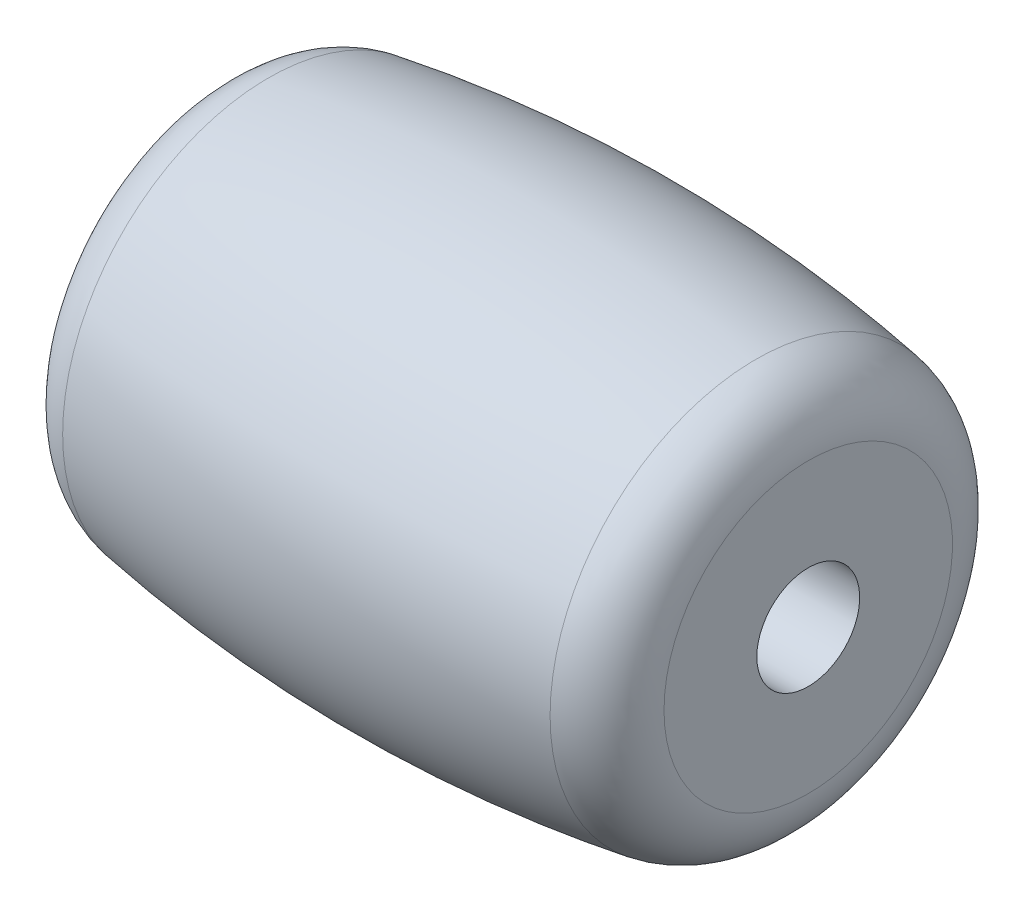
ISO-10303-21;
HEADER;
FILE_DESCRIPTION(('STEP AP214'),'2;1');
FILE_NAME('part.step','',(''),(''),'','','');
FILE_SCHEMA(('AUTOMOTIVE_DESIGN { 1 0 10303 214 1 1 1 1 }'));
ENDSEC;
DATA;
#1=APPLICATION_CONTEXT('core data for automotive mechanical design processes');
#2=APPLICATION_PROTOCOL_DEFINITION('international standard','automotive_design',2000,#1);
#3=PRODUCT_CONTEXT('',#1,'mechanical');
#4=PRODUCT('Part','Part','',(#3));
#5=PRODUCT_RELATED_PRODUCT_CATEGORY('part','',(#4));
#6=PRODUCT_DEFINITION_FORMATION('','',#4);
#7=PRODUCT_DEFINITION_CONTEXT('part definition',#1,'design');
#8=PRODUCT_DEFINITION('design','',#6,#7);
#9=PRODUCT_DEFINITION_SHAPE('','',#8);
#10=(LENGTH_UNIT() NAMED_UNIT(*) SI_UNIT(.MILLI.,.METRE.));
#11=(NAMED_UNIT(*) PLANE_ANGLE_UNIT() SI_UNIT($,.RADIAN.));
#12=(NAMED_UNIT(*) SI_UNIT($,.STERADIAN.) SOLID_ANGLE_UNIT());
#13=UNCERTAINTY_MEASURE_WITH_UNIT(LENGTH_MEASURE(1.E-05),#10,'distance_accuracy_value','');
#14=(GEOMETRIC_REPRESENTATION_CONTEXT(3) GLOBAL_UNCERTAINTY_ASSIGNED_CONTEXT((#13)) GLOBAL_UNIT_ASSIGNED_CONTEXT((#10,
#11,#12)) REPRESENTATION_CONTEXT('',''));
#15=CARTESIAN_POINT('',(0.,0.,0.));
#16=DIRECTION('',(0.,0.,1.));
#17=DIRECTION('',(1.,0.,0.));
#18=AXIS2_PLACEMENT_3D('',#15,#16,#17);
#19=CARTESIAN_POINT('',(7.5,0.,0.));
#20=DIRECTION('',(-1.,0.,0.));
#21=DIRECTION('',(0.,0.,1.));
#22=AXIS2_PLACEMENT_3D('',#19,#20,#21);
#23=TOROIDAL_SURFACE('',#22,4.627561796352,2.00000000000046);
#24=CARTESIAN_POINT('',(9.5,0.,0.));
#25=DIRECTION('',(-1.,0.,0.));
#26=DIRECTION('',(0.,0.,1.));
#27=AXIS2_PLACEMENT_3D('',#24,#25,#26);
#28=CIRCLE('',#27,4.627561796352);
#29=CARTESIAN_POINT('',(9.5,0.,4.627561796352));
#30=VERTEX_POINT('',#29);
#31=EDGE_CURVE('E10',#30,#30,#28,.T.);
#32=ORIENTED_EDGE('',*,*,#31,.T.);
#33=EDGE_LOOP('',(#32));
#34=FACE_BOUND('',#33,.T.);
#35=CARTESIAN_POINT('',(7.81924059641901,0.,0.));
#36=DIRECTION('',(-1.,0.,0.));
#37=DIRECTION('',(0.,0.,1.));
#38=AXIS2_PLACEMENT_3D('',#35,#36,#37);
#39=CIRCLE('',#38,6.60191876549436);
#40=CARTESIAN_POINT('',(7.81924059641901,0.,6.60191876549436));
#41=VERTEX_POINT('',#40);
#42=EDGE_CURVE('E53',#41,#41,#39,.T.);
#43=ORIENTED_EDGE('',*,*,#42,.F.);
#44=EDGE_LOOP('',(#43));
#45=FACE_BOUND('',#44,.T.);
#46=ADVANCED_FACE('F31',(#34,#45),#23,.T.);
#47=CARTESIAN_POINT('',(9.5,4.627561796352,0.));
#48=DIRECTION('',(1.,0.,0.));
#49=DIRECTION('',(0.,0.,-1.));
#50=AXIS2_PLACEMENT_3D('',#47,#48,#49);
#51=PLANE('',#50);
#52=CARTESIAN_POINT('',(9.5,0.,0.));
#53=DIRECTION('',(-1.,0.,0.));
#54=DIRECTION('',(0.,0.,1.));
#55=AXIS2_PLACEMENT_3D('',#52,#53,#54);
#56=CIRCLE('',#55,1.65);
#57=CARTESIAN_POINT('',(9.5,0.,1.65));
#58=VERTEX_POINT('',#57);
#59=EDGE_CURVE('E37',#58,#58,#56,.T.);
#60=ORIENTED_EDGE('',*,*,#59,.T.);
#61=EDGE_LOOP('',(#60));
#62=FACE_BOUND('',#61,.T.);
#63=ORIENTED_EDGE('',*,*,#31,.F.);
#64=EDGE_LOOP('',(#63));
#65=FACE_BOUND('',#64,.T.);
#66=ADVANCED_FACE('F61',(#62,#65),#51,.T.);
#67=CARTESIAN_POINT('',(9.50308908178157,0.,0.));
#68=DIRECTION('',(-1.,0.,0.));
#69=DIRECTION('',(0.,0.,1.));
#70=AXIS2_PLACEMENT_3D('',#67,#68,#69);
#71=CYLINDRICAL_SURFACE('',#70,1.65);
#72=CARTESIAN_POINT('',(-9.5,0.,0.));
#73=DIRECTION('',(-1.,0.,0.));
#74=DIRECTION('',(0.,0.,1.));
#75=AXIS2_PLACEMENT_3D('',#72,#73,#74);
#76=CIRCLE('',#75,1.65);
#77=CARTESIAN_POINT('',(-9.5,0.,1.65));
#78=VERTEX_POINT('',#77);
#79=EDGE_CURVE('E41',#78,#78,#76,.T.);
#80=ORIENTED_EDGE('',*,*,#79,.T.);
#81=EDGE_LOOP('',(#80));
#82=FACE_BOUND('',#81,.T.);
#83=ORIENTED_EDGE('',*,*,#59,.F.);
#84=EDGE_LOOP('',(#83));
#85=FACE_BOUND('',#84,.T.);
#86=ADVANCED_FACE('F65',(#82,#85),#71,.F.);
#87=CARTESIAN_POINT('',(-9.5,1.65,0.));
#88=DIRECTION('',(-1.,0.,0.));
#89=DIRECTION('',(0.,0.,1.));
#90=AXIS2_PLACEMENT_3D('',#87,#88,#89);
#91=PLANE('',#90);
#92=CARTESIAN_POINT('',(-9.5,0.,0.));
#93=DIRECTION('',(-1.,0.,0.));
#94=DIRECTION('',(0.,0.,1.));
#95=AXIS2_PLACEMENT_3D('',#92,#93,#94);
#96=CIRCLE('',#95,4.627561796352);
#97=CARTESIAN_POINT('',(-9.5,0.,4.627561796352));
#98=VERTEX_POINT('',#97);
#99=EDGE_CURVE('E45',#98,#98,#96,.T.);
#100=ORIENTED_EDGE('',*,*,#99,.T.);
#101=EDGE_LOOP('',(#100));
#102=FACE_BOUND('',#101,.T.);
#103=ORIENTED_EDGE('',*,*,#79,.F.);
#104=EDGE_LOOP('',(#103));
#105=FACE_BOUND('',#104,.T.);
#106=ADVANCED_FACE('F69',(#102,#105),#91,.T.);
#107=CARTESIAN_POINT('',(-7.5,0.,0.));
#108=DIRECTION('',(-1.,0.,0.));
#109=DIRECTION('',(0.,0.,1.));
#110=AXIS2_PLACEMENT_3D('',#107,#108,#109);
#111=TOROIDAL_SURFACE('',#110,4.627561796352,2.00000000000028);
#112=CARTESIAN_POINT('',(-7.81924059641899,0.,0.));
#113=DIRECTION('',(-1.,0.,0.));
#114=DIRECTION('',(0.,0.,1.));
#115=AXIS2_PLACEMENT_3D('',#112,#113,#114);
#116=CIRCLE('',#115,6.6019187654939);
#117=CARTESIAN_POINT('',(-7.81924059641899,0.,6.6019187654939));
#118=VERTEX_POINT('',#117);
#119=EDGE_CURVE('E50',#118,#118,#116,.T.);
#120=ORIENTED_EDGE('',*,*,#119,.T.);
#121=EDGE_LOOP('',(#120));
#122=FACE_BOUND('',#121,.T.);
#123=ORIENTED_EDGE('',*,*,#99,.F.);
#124=EDGE_LOOP('',(#123));
#125=FACE_BOUND('',#124,.T.);
#126=ADVANCED_FACE('F76',(#122,#125),#111,.T.);
#127=CARTESIAN_POINT('',(0.,0.,0.));
#128=DIRECTION('',(-1.,0.,0.));
#129=DIRECTION('',(0.,0.,1.));
#130=AXIS2_PLACEMENT_3D('',#127,#128,#129);
#131=DEGENERATE_TOROIDAL_SURFACE('',#130,41.7565053763542,48.9865053763545,.F.);
#132=ORIENTED_EDGE('',*,*,#42,.T.);
#133=EDGE_LOOP('',(#132));
#134=FACE_BOUND('',#133,.T.);
#135=ORIENTED_EDGE('',*,*,#119,.F.);
#136=EDGE_LOOP('',(#135));
#137=FACE_BOUND('',#136,.T.);
#138=ADVANCED_FACE('F57',(#134,#137),#131,.F.);
#139=CLOSED_SHELL('',(#46,#66,#86,#106,#126,#138));
#140=MANIFOLD_SOLID_BREP('B2',#139);
#141=ADVANCED_BREP_SHAPE_REPRESENTATION('',(#18,#140),#14);
#142=SHAPE_DEFINITION_REPRESENTATION(#9,#141);
ENDSEC;
END-ISO-10303-21;
